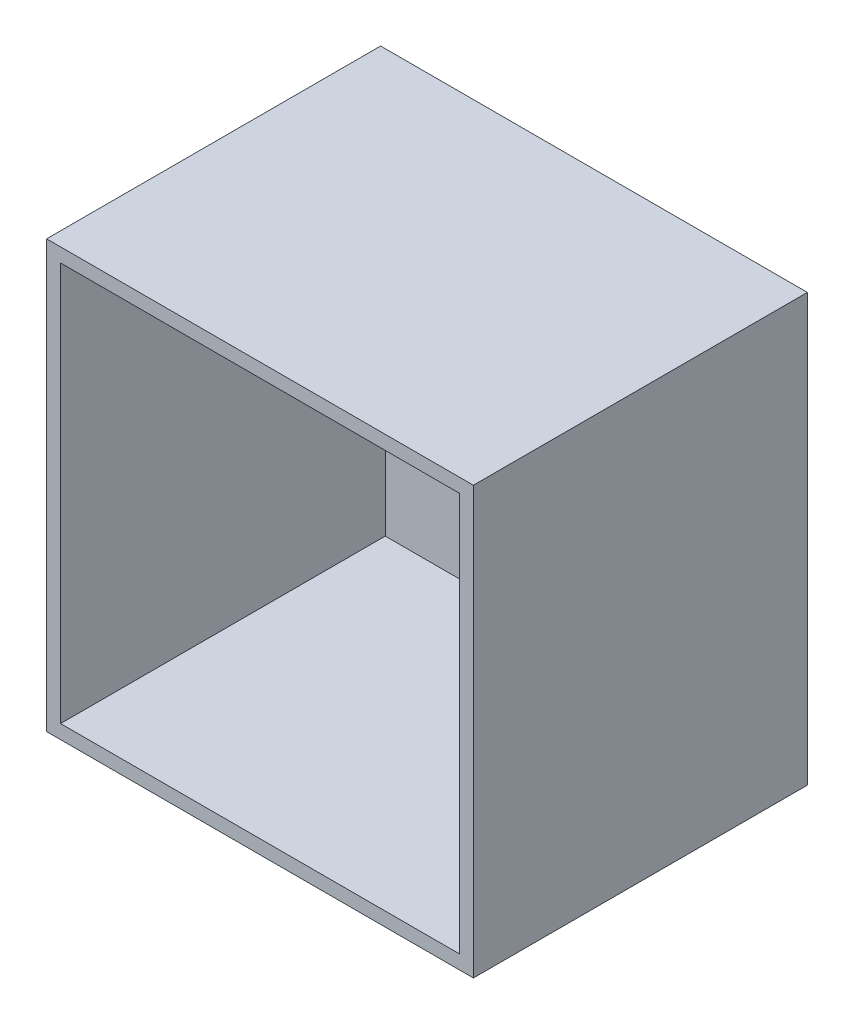
ISO-10303-21;
HEADER;
FILE_DESCRIPTION(('STEP AP214'),'2;1');
FILE_NAME('part.step','',(''),(''),'','','');
FILE_SCHEMA(('AUTOMOTIVE_DESIGN { 1 0 10303 214 1 1 1 1 }'));
ENDSEC;
DATA;
#1=APPLICATION_CONTEXT('core data for automotive mechanical design processes');
#2=APPLICATION_PROTOCOL_DEFINITION('international standard','automotive_design',2000,#1);
#3=PRODUCT_CONTEXT('',#1,'mechanical');
#4=PRODUCT('Part','Part','',(#3));
#5=PRODUCT_RELATED_PRODUCT_CATEGORY('part','',(#4));
#6=PRODUCT_DEFINITION_FORMATION('','',#4);
#7=PRODUCT_DEFINITION_CONTEXT('part definition',#1,'design');
#8=PRODUCT_DEFINITION('design','',#6,#7);
#9=PRODUCT_DEFINITION_SHAPE('','',#8);
#10=(LENGTH_UNIT() NAMED_UNIT(*) SI_UNIT(.MILLI.,.METRE.));
#11=(NAMED_UNIT(*) PLANE_ANGLE_UNIT() SI_UNIT($,.RADIAN.));
#12=(NAMED_UNIT(*) SI_UNIT($,.STERADIAN.) SOLID_ANGLE_UNIT());
#13=UNCERTAINTY_MEASURE_WITH_UNIT(LENGTH_MEASURE(1.E-05),#10,'distance_accuracy_value','');
#14=(GEOMETRIC_REPRESENTATION_CONTEXT(3) GLOBAL_UNCERTAINTY_ASSIGNED_CONTEXT((#13)) GLOBAL_UNIT_ASSIGNED_CONTEXT((#10,
#11,#12)) REPRESENTATION_CONTEXT('',''));
#15=CARTESIAN_POINT('',(0.,0.,0.));
#16=DIRECTION('',(0.,0.,1.));
#17=DIRECTION('',(1.,0.,0.));
#18=AXIS2_PLACEMENT_3D('',#15,#16,#17);
#19=CARTESIAN_POINT('',(23.,23.,36.));
#20=DIRECTION('',(-1.,0.,0.));
#21=DIRECTION('',(0.,-1.,0.));
#22=AXIS2_PLACEMENT_3D('',#19,#20,#21);
#23=PLANE('',#22);
#24=DIRECTION('',(0.,1.,0.));
#25=VECTOR('',#24,1.);
#26=CARTESIAN_POINT('',(23.,23.,0.));
#27=LINE('',#26,#25);
#28=CARTESIAN_POINT('',(23.,-23.,0.));
#29=VERTEX_POINT('',#28);
#30=CARTESIAN_POINT('',(23.,23.,0.));
#31=VERTEX_POINT('',#30);
#32=EDGE_CURVE('E144',#29,#31,#27,.T.);
#33=ORIENTED_EDGE('',*,*,#32,.T.);
#34=DIRECTION('',(0.,0.,-1.));
#35=VECTOR('',#34,1.);
#36=CARTESIAN_POINT('',(23.,23.,36.));
#37=LINE('',#36,#35);
#38=CARTESIAN_POINT('',(23.,23.,36.));
#39=VERTEX_POINT('',#38);
#40=EDGE_CURVE('E11',#39,#31,#37,.T.);
#41=ORIENTED_EDGE('',*,*,#40,.F.);
#42=DIRECTION('',(0.,1.,0.));
#43=VECTOR('',#42,1.);
#44=CARTESIAN_POINT('',(23.,23.,36.));
#45=LINE('',#44,#43);
#46=CARTESIAN_POINT('',(23.,-23.,36.));
#47=VERTEX_POINT('',#46);
#48=EDGE_CURVE('E148',#47,#39,#45,.T.);
#49=ORIENTED_EDGE('',*,*,#48,.F.);
#50=DIRECTION('',(0.,0.,-1.));
#51=VECTOR('',#50,1.);
#52=CARTESIAN_POINT('',(23.,-23.,36.));
#53=LINE('',#52,#51);
#54=EDGE_CURVE('E154',#47,#29,#53,.T.);
#55=ORIENTED_EDGE('',*,*,#54,.T.);
#56=EDGE_LOOP('',(#33,#41,#49,#55));
#57=FACE_BOUND('',#56,.T.);
#58=ADVANCED_FACE('F33',(#57),#23,.F.);
#59=CARTESIAN_POINT('',(-23.,23.,36.));
#60=DIRECTION('',(0.,-1.,0.));
#61=DIRECTION('',(0.,0.,-1.));
#62=AXIS2_PLACEMENT_3D('',#59,#60,#61);
#63=PLANE('',#62);
#64=DIRECTION('',(-1.,0.,0.));
#65=VECTOR('',#64,1.);
#66=CARTESIAN_POINT('',(-23.,23.,0.));
#67=LINE('',#66,#65);
#68=CARTESIAN_POINT('',(-23.,23.,0.));
#69=VERTEX_POINT('',#68);
#70=EDGE_CURVE('E157',#31,#69,#67,.T.);
#71=ORIENTED_EDGE('',*,*,#70,.T.);
#72=DIRECTION('',(0.,0.,-1.));
#73=VECTOR('',#72,1.);
#74=CARTESIAN_POINT('',(-23.,23.,36.));
#75=LINE('',#74,#73);
#76=CARTESIAN_POINT('',(-23.,23.,36.));
#77=VERTEX_POINT('',#76);
#78=EDGE_CURVE('E41',#77,#69,#75,.T.);
#79=ORIENTED_EDGE('',*,*,#78,.F.);
#80=DIRECTION('',(-1.,0.,0.));
#81=VECTOR('',#80,1.);
#82=CARTESIAN_POINT('',(-23.,23.,36.));
#83=LINE('',#82,#81);
#84=EDGE_CURVE('E85',#39,#77,#83,.T.);
#85=ORIENTED_EDGE('',*,*,#84,.F.);
#86=ORIENTED_EDGE('',*,*,#40,.T.);
#87=EDGE_LOOP('',(#71,#79,#85,#86));
#88=FACE_BOUND('',#87,.T.);
#89=ADVANCED_FACE('F187',(#88),#63,.F.);
#90=CARTESIAN_POINT('',(-23.,23.,36.));
#91=DIRECTION('',(1.,0.,0.));
#92=DIRECTION('',(0.,1.,0.));
#93=AXIS2_PLACEMENT_3D('',#90,#91,#92);
#94=PLANE('',#93);
#95=DIRECTION('',(0.,-1.,0.));
#96=VECTOR('',#95,1.);
#97=CARTESIAN_POINT('',(-23.,23.,0.));
#98=LINE('',#97,#96);
#99=CARTESIAN_POINT('',(-23.,-23.,0.));
#100=VERTEX_POINT('',#99);
#101=EDGE_CURVE('E159',#69,#100,#98,.T.);
#102=ORIENTED_EDGE('',*,*,#101,.T.);
#103=DIRECTION('',(0.,0.,-1.));
#104=VECTOR('',#103,1.);
#105=CARTESIAN_POINT('',(-23.,-23.,36.));
#106=LINE('',#105,#104);
#107=CARTESIAN_POINT('',(-23.,-23.,36.));
#108=VERTEX_POINT('',#107);
#109=EDGE_CURVE('E163',#108,#100,#106,.T.);
#110=ORIENTED_EDGE('',*,*,#109,.F.);
#111=DIRECTION('',(0.,-1.,0.));
#112=VECTOR('',#111,1.);
#113=CARTESIAN_POINT('',(-23.,23.,36.));
#114=LINE('',#113,#112);
#115=EDGE_CURVE('E151',#77,#108,#114,.T.);
#116=ORIENTED_EDGE('',*,*,#115,.F.);
#117=ORIENTED_EDGE('',*,*,#78,.T.);
#118=EDGE_LOOP('',(#102,#110,#116,#117));
#119=FACE_BOUND('',#118,.T.);
#120=ADVANCED_FACE('F169',(#119),#94,.F.);
#121=CARTESIAN_POINT('',(-23.,-23.,36.));
#122=DIRECTION('',(0.,1.,0.));
#123=DIRECTION('',(0.,0.,1.));
#124=AXIS2_PLACEMENT_3D('',#121,#122,#123);
#125=PLANE('',#124);
#126=DIRECTION('',(1.,0.,0.));
#127=VECTOR('',#126,1.);
#128=CARTESIAN_POINT('',(-23.,-23.,0.));
#129=LINE('',#128,#127);
#130=EDGE_CURVE('E78',#100,#29,#129,.T.);
#131=ORIENTED_EDGE('',*,*,#130,.T.);
#132=ORIENTED_EDGE('',*,*,#54,.F.);
#133=DIRECTION('',(1.,0.,0.));
#134=VECTOR('',#133,1.);
#135=CARTESIAN_POINT('',(-23.,-23.,36.));
#136=LINE('',#135,#134);
#137=EDGE_CURVE('E57',#108,#47,#136,.T.);
#138=ORIENTED_EDGE('',*,*,#137,.F.);
#139=ORIENTED_EDGE('',*,*,#109,.T.);
#140=EDGE_LOOP('',(#131,#132,#138,#139));
#141=FACE_BOUND('',#140,.T.);
#142=ADVANCED_FACE('F177',(#141),#125,.F.);
#143=CARTESIAN_POINT('',(0.,0.,36.));
#144=DIRECTION('',(0.,0.,1.));
#145=DIRECTION('',(1.,0.,0.));
#146=AXIS2_PLACEMENT_3D('',#143,#144,#145);
#147=PLANE('',#146);
#148=DIRECTION('',(0.,1.,0.));
#149=VECTOR('',#148,1.);
#150=CARTESIAN_POINT('',(21.5,21.5,36.));
#151=LINE('',#150,#149);
#152=CARTESIAN_POINT('',(21.5,-21.5,36.));
#153=VERTEX_POINT('',#152);
#154=CARTESIAN_POINT('',(21.5,21.5,36.));
#155=VERTEX_POINT('',#154);
#156=EDGE_CURVE('E48',#153,#155,#151,.T.);
#157=ORIENTED_EDGE('',*,*,#156,.F.);
#158=DIRECTION('',(1.,0.,0.));
#159=VECTOR('',#158,1.);
#160=CARTESIAN_POINT('',(-21.5,-21.5,36.));
#161=LINE('',#160,#159);
#162=CARTESIAN_POINT('',(-21.5,-21.5,36.));
#163=VERTEX_POINT('',#162);
#164=EDGE_CURVE('E127',#163,#153,#161,.T.);
#165=ORIENTED_EDGE('',*,*,#164,.F.);
#166=DIRECTION('',(0.,-1.,0.));
#167=VECTOR('',#166,1.);
#168=CARTESIAN_POINT('',(-21.5,21.5,36.));
#169=LINE('',#168,#167);
#170=CARTESIAN_POINT('',(-21.5,21.5,36.));
#171=VERTEX_POINT('',#170);
#172=EDGE_CURVE('E130',#171,#163,#169,.T.);
#173=ORIENTED_EDGE('',*,*,#172,.F.);
#174=DIRECTION('',(-1.,0.,0.));
#175=VECTOR('',#174,1.);
#176=CARTESIAN_POINT('',(-21.5,21.5,36.));
#177=LINE('',#176,#175);
#178=EDGE_CURVE('E138',#155,#171,#177,.T.);
#179=ORIENTED_EDGE('',*,*,#178,.F.);
#180=EDGE_LOOP('',(#157,#165,#173,#179));
#181=FACE_BOUND('',#180,.T.);
#182=ORIENTED_EDGE('',*,*,#48,.T.);
#183=ORIENTED_EDGE('',*,*,#84,.T.);
#184=ORIENTED_EDGE('',*,*,#115,.T.);
#185=ORIENTED_EDGE('',*,*,#137,.T.);
#186=EDGE_LOOP('',(#182,#183,#184,#185));
#187=FACE_BOUND('',#186,.T.);
#188=ADVANCED_FACE('F179',(#181,#187),#147,.T.);
#189=CARTESIAN_POINT('',(0.,0.,0.));
#190=DIRECTION('',(0.,0.,1.));
#191=DIRECTION('',(1.,0.,0.));
#192=AXIS2_PLACEMENT_3D('',#189,#190,#191);
#193=PLANE('',#192);
#194=CARTESIAN_POINT('',(0.,0.,0.));
#195=DIRECTION('',(0.,0.,-1.));
#196=DIRECTION('',(-1.,0.,0.));
#197=AXIS2_PLACEMENT_3D('',#194,#195,#196);
#198=CIRCLE('',#197,10.);
#199=CARTESIAN_POINT('',(-10.,0.,0.));
#200=VERTEX_POINT('',#199);
#201=EDGE_CURVE('E133',#200,#200,#198,.T.);
#202=ORIENTED_EDGE('',*,*,#201,.F.);
#203=EDGE_LOOP('',(#202));
#204=FACE_BOUND('',#203,.T.);
#205=ORIENTED_EDGE('',*,*,#32,.F.);
#206=ORIENTED_EDGE('',*,*,#130,.F.);
#207=ORIENTED_EDGE('',*,*,#101,.F.);
#208=ORIENTED_EDGE('',*,*,#70,.F.);
#209=EDGE_LOOP('',(#205,#206,#207,#208));
#210=FACE_BOUND('',#209,.T.);
#211=ADVANCED_FACE('F173',(#204,#210),#193,.F.);
#212=CARTESIAN_POINT('',(21.5,21.5,0.999999999999994));
#213=DIRECTION('',(1.,0.,0.));
#214=DIRECTION('',(0.,1.,0.));
#215=AXIS2_PLACEMENT_3D('',#212,#213,#214);
#216=PLANE('',#215);
#217=ORIENTED_EDGE('',*,*,#156,.T.);
#218=DIRECTION('',(0.,0.,1.));
#219=VECTOR('',#218,1.);
#220=CARTESIAN_POINT('',(21.5,21.5,0.999999999999994));
#221=LINE('',#220,#219);
#222=CARTESIAN_POINT('',(21.5,21.5,0.999999999999994));
#223=VERTEX_POINT('',#222);
#224=EDGE_CURVE('E105',#223,#155,#221,.T.);
#225=ORIENTED_EDGE('',*,*,#224,.F.);
#226=DIRECTION('',(0.,1.,0.));
#227=VECTOR('',#226,1.);
#228=CARTESIAN_POINT('',(21.5,21.5,0.999999999999994));
#229=LINE('',#228,#227);
#230=CARTESIAN_POINT('',(21.5,-21.5,0.999999999999994));
#231=VERTEX_POINT('',#230);
#232=EDGE_CURVE('E109',#231,#223,#229,.T.);
#233=ORIENTED_EDGE('',*,*,#232,.F.);
#234=DIRECTION('',(0.,0.,1.));
#235=VECTOR('',#234,1.);
#236=CARTESIAN_POINT('',(21.5,-21.5,0.999999999999994));
#237=LINE('',#236,#235);
#238=EDGE_CURVE('E142',#231,#153,#237,.T.);
#239=ORIENTED_EDGE('',*,*,#238,.T.);
#240=EDGE_LOOP('',(#217,#225,#233,#239));
#241=FACE_BOUND('',#240,.T.);
#242=ADVANCED_FACE('F107',(#241),#216,.F.);
#243=CARTESIAN_POINT('',(-21.5,-21.5,0.999999999999994));
#244=DIRECTION('',(0.,-1.,0.));
#245=DIRECTION('',(0.,0.,-1.));
#246=AXIS2_PLACEMENT_3D('',#243,#244,#245);
#247=PLANE('',#246);
#248=ORIENTED_EDGE('',*,*,#164,.T.);
#249=ORIENTED_EDGE('',*,*,#238,.F.);
#250=DIRECTION('',(1.,0.,0.));
#251=VECTOR('',#250,1.);
#252=CARTESIAN_POINT('',(-21.5,-21.5,0.999999999999994));
#253=LINE('',#252,#251);
#254=CARTESIAN_POINT('',(-21.5,-21.5,0.999999999999994));
#255=VERTEX_POINT('',#254);
#256=EDGE_CURVE('E115',#255,#231,#253,.T.);
#257=ORIENTED_EDGE('',*,*,#256,.F.);
#258=DIRECTION('',(0.,0.,1.));
#259=VECTOR('',#258,1.);
#260=CARTESIAN_POINT('',(-21.5,-21.5,0.999999999999994));
#261=LINE('',#260,#259);
#262=EDGE_CURVE('E145',#255,#163,#261,.T.);
#263=ORIENTED_EDGE('',*,*,#262,.T.);
#264=EDGE_LOOP('',(#248,#249,#257,#263));
#265=FACE_BOUND('',#264,.T.);
#266=ADVANCED_FACE('F221',(#265),#247,.F.);
#267=CARTESIAN_POINT('',(-21.5,21.5,0.999999999999994));
#268=DIRECTION('',(-1.,0.,0.));
#269=DIRECTION('',(0.,-1.,0.));
#270=AXIS2_PLACEMENT_3D('',#267,#268,#269);
#271=PLANE('',#270);
#272=ORIENTED_EDGE('',*,*,#172,.T.);
#273=ORIENTED_EDGE('',*,*,#262,.F.);
#274=DIRECTION('',(0.,-1.,0.));
#275=VECTOR('',#274,1.);
#276=CARTESIAN_POINT('',(-21.5,21.5,0.999999999999994));
#277=LINE('',#276,#275);
#278=CARTESIAN_POINT('',(-21.5,21.5,0.999999999999994));
#279=VERTEX_POINT('',#278);
#280=EDGE_CURVE('E123',#279,#255,#277,.T.);
#281=ORIENTED_EDGE('',*,*,#280,.F.);
#282=DIRECTION('',(0.,0.,1.));
#283=VECTOR('',#282,1.);
#284=CARTESIAN_POINT('',(-21.5,21.5,0.999999999999994));
#285=LINE('',#284,#283);
#286=EDGE_CURVE('E114',#279,#171,#285,.T.);
#287=ORIENTED_EDGE('',*,*,#286,.T.);
#288=EDGE_LOOP('',(#272,#273,#281,#287));
#289=FACE_BOUND('',#288,.T.);
#290=ADVANCED_FACE('F230',(#289),#271,.F.);
#291=CARTESIAN_POINT('',(-21.5,21.5,0.999999999999994));
#292=DIRECTION('',(0.,1.,0.));
#293=DIRECTION('',(0.,0.,1.));
#294=AXIS2_PLACEMENT_3D('',#291,#292,#293);
#295=PLANE('',#294);
#296=ORIENTED_EDGE('',*,*,#178,.T.);
#297=ORIENTED_EDGE('',*,*,#286,.F.);
#298=DIRECTION('',(-1.,0.,0.));
#299=VECTOR('',#298,1.);
#300=CARTESIAN_POINT('',(-21.5,21.5,0.999999999999994));
#301=LINE('',#300,#299);
#302=EDGE_CURVE('E118',#223,#279,#301,.T.);
#303=ORIENTED_EDGE('',*,*,#302,.F.);
#304=ORIENTED_EDGE('',*,*,#224,.T.);
#305=EDGE_LOOP('',(#296,#297,#303,#304));
#306=FACE_BOUND('',#305,.T.);
#307=ADVANCED_FACE('F119',(#306),#295,.F.);
#308=CARTESIAN_POINT('',(0.,0.,0.999999999999994));
#309=DIRECTION('',(0.,0.,1.));
#310=DIRECTION('',(1.,0.,0.));
#311=AXIS2_PLACEMENT_3D('',#308,#309,#310);
#312=PLANE('',#311);
#313=CARTESIAN_POINT('',(0.,0.,0.999999999999994));
#314=DIRECTION('',(0.,0.,1.));
#315=DIRECTION('',(1.,0.,0.));
#316=AXIS2_PLACEMENT_3D('',#313,#314,#315);
#317=CIRCLE('',#316,10.);
#318=CARTESIAN_POINT('',(10.,0.,0.999999999999994));
#319=VERTEX_POINT('',#318);
#320=EDGE_CURVE('E36',#319,#319,#317,.T.);
#321=ORIENTED_EDGE('',*,*,#320,.F.);
#322=EDGE_LOOP('',(#321));
#323=FACE_BOUND('',#322,.T.);
#324=ORIENTED_EDGE('',*,*,#232,.T.);
#325=ORIENTED_EDGE('',*,*,#302,.T.);
#326=ORIENTED_EDGE('',*,*,#280,.T.);
#327=ORIENTED_EDGE('',*,*,#256,.T.);
#328=EDGE_LOOP('',(#324,#325,#326,#327));
#329=FACE_BOUND('',#328,.T.);
#330=ADVANCED_FACE('F125',(#323,#329),#312,.T.);
#331=CARTESIAN_POINT('',(0.,0.,35.));
#332=DIRECTION('',(0.,0.,-1.));
#333=DIRECTION('',(-1.,0.,0.));
#334=AXIS2_PLACEMENT_3D('',#331,#332,#333);
#335=CYLINDRICAL_SURFACE('',#334,10.);
#336=ORIENTED_EDGE('',*,*,#320,.T.);
#337=EDGE_LOOP('',(#336));
#338=FACE_BOUND('',#337,.T.);
#339=ORIENTED_EDGE('',*,*,#201,.T.);
#340=EDGE_LOOP('',(#339));
#341=FACE_BOUND('',#340,.T.);
#342=ADVANCED_FACE('F263',(#338,#341),#335,.F.);
#343=CLOSED_SHELL('',(#58,#89,#120,#142,#188,#211,#242,#266,#290,#307,#330,#342));
#344=MANIFOLD_SOLID_BREP('B2',#343);
#345=ADVANCED_BREP_SHAPE_REPRESENTATION('',(#18,#344),#14);
#346=SHAPE_DEFINITION_REPRESENTATION(#9,#345);
ENDSEC;
END-ISO-10303-21;
